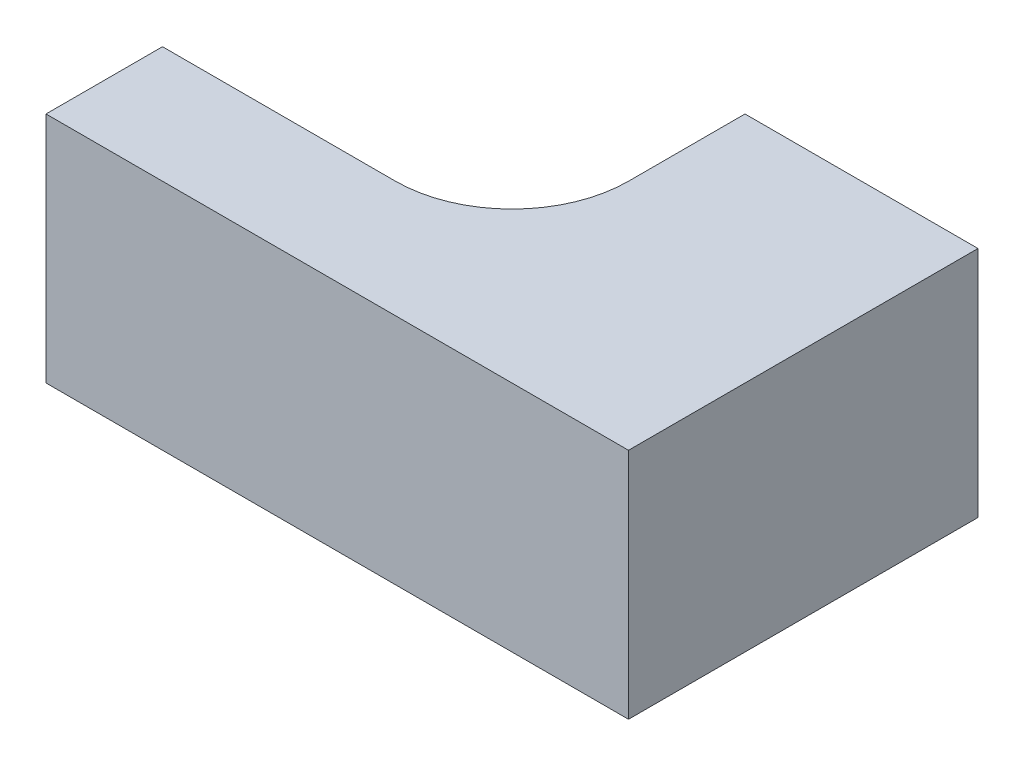
ISO-10303-21;
HEADER;
FILE_DESCRIPTION(('STEP AP214'),'2;1');
FILE_NAME('part.step','',(''),(''),'','','');
FILE_SCHEMA(('AUTOMOTIVE_DESIGN { 1 0 10303 214 1 1 1 1 }'));
ENDSEC;
DATA;
#1=APPLICATION_CONTEXT('core data for automotive mechanical design processes');
#2=APPLICATION_PROTOCOL_DEFINITION('international standard','automotive_design',2000,#1);
#3=PRODUCT_CONTEXT('',#1,'mechanical');
#4=PRODUCT('Part','Part','',(#3));
#5=PRODUCT_RELATED_PRODUCT_CATEGORY('part','',(#4));
#6=PRODUCT_DEFINITION_FORMATION('','',#4);
#7=PRODUCT_DEFINITION_CONTEXT('part definition',#1,'design');
#8=PRODUCT_DEFINITION('design','',#6,#7);
#9=PRODUCT_DEFINITION_SHAPE('','',#8);
#10=(LENGTH_UNIT() NAMED_UNIT(*) SI_UNIT(.MILLI.,.METRE.));
#11=(NAMED_UNIT(*) PLANE_ANGLE_UNIT() SI_UNIT($,.RADIAN.));
#12=(NAMED_UNIT(*) SI_UNIT($,.STERADIAN.) SOLID_ANGLE_UNIT());
#13=UNCERTAINTY_MEASURE_WITH_UNIT(LENGTH_MEASURE(1.E-05),#10,'distance_accuracy_value','');
#14=(GEOMETRIC_REPRESENTATION_CONTEXT(3) GLOBAL_UNCERTAINTY_ASSIGNED_CONTEXT((#13)) GLOBAL_UNIT_ASSIGNED_CONTEXT((#10,
#11,#12)) REPRESENTATION_CONTEXT('',''));
#15=CARTESIAN_POINT('',(0.,0.,0.));
#16=DIRECTION('',(0.,0.,1.));
#17=DIRECTION('',(1.,0.,0.));
#18=AXIS2_PLACEMENT_3D('',#15,#16,#17);
#19=CARTESIAN_POINT('',(-20.,20.,0.));
#20=DIRECTION('',(0.,0.,1.));
#21=DIRECTION('',(-1.,0.,0.));
#22=AXIS2_PLACEMENT_3D('',#19,#20,#21);
#23=PLANE('',#22);
#24=DIRECTION('',(1.,0.,0.));
#25=VECTOR('',#24,1.);
#26=CARTESIAN_POINT('',(-20.,0.,0.));
#27=LINE('',#26,#25);
#28=CARTESIAN_POINT('',(-40.,0.,0.));
#29=VERTEX_POINT('',#28);
#30=CARTESIAN_POINT('',(-20.,0.,0.));
#31=VERTEX_POINT('',#30);
#32=EDGE_CURVE('E134',#29,#31,#27,.T.);
#33=ORIENTED_EDGE('',*,*,#32,.F.);
#34=DIRECTION('',(0.,-1.,0.));
#35=VECTOR('',#34,1.);
#36=CARTESIAN_POINT('',(-40.,20.,0.));
#37=LINE('',#36,#35);
#38=CARTESIAN_POINT('',(-40.,20.,0.));
#39=VERTEX_POINT('',#38);
#40=EDGE_CURVE('E133',#39,#29,#37,.T.);
#41=ORIENTED_EDGE('',*,*,#40,.F.);
#42=DIRECTION('',(1.,0.,0.));
#43=VECTOR('',#42,1.);
#44=CARTESIAN_POINT('',(-20.,20.,0.));
#45=LINE('',#44,#43);
#46=CARTESIAN_POINT('',(-20.,20.,0.));
#47=VERTEX_POINT('',#46);
#48=EDGE_CURVE('E156',#39,#47,#45,.T.);
#49=ORIENTED_EDGE('',*,*,#48,.T.);
#50=DIRECTION('',(0.,-1.,0.));
#51=VECTOR('',#50,1.);
#52=CARTESIAN_POINT('',(-20.,20.,0.));
#53=LINE('',#52,#51);
#54=EDGE_CURVE('E11',#47,#31,#53,.T.);
#55=ORIENTED_EDGE('',*,*,#54,.T.);
#56=EDGE_LOOP('',(#33,#41,#49,#55));
#57=FACE_BOUND('',#56,.T.);
#58=ADVANCED_FACE('F38',(#57),#23,.F.);
#59=CARTESIAN_POINT('',(-20.,20.,30.));
#60=DIRECTION('',(-1.,0.,0.));
#61=DIRECTION('',(0.,0.,-1.));
#62=AXIS2_PLACEMENT_3D('',#59,#60,#61);
#63=PLANE('',#62);
#64=DIRECTION('',(0.,0.,1.));
#65=VECTOR('',#64,1.);
#66=CARTESIAN_POINT('',(-20.,0.,30.));
#67=LINE('',#66,#65);
#68=CARTESIAN_POINT('',(-20.,0.,30.));
#69=VERTEX_POINT('',#68);
#70=EDGE_CURVE('E137',#31,#69,#67,.T.);
#71=ORIENTED_EDGE('',*,*,#70,.F.);
#72=ORIENTED_EDGE('',*,*,#54,.F.);
#73=DIRECTION('',(0.,0.,1.));
#74=VECTOR('',#73,1.);
#75=CARTESIAN_POINT('',(-20.,20.,30.));
#76=LINE('',#75,#74);
#77=CARTESIAN_POINT('',(-20.,20.,30.));
#78=VERTEX_POINT('',#77);
#79=EDGE_CURVE('E90',#47,#78,#76,.T.);
#80=ORIENTED_EDGE('',*,*,#79,.T.);
#81=DIRECTION('',(0.,-1.,0.));
#82=VECTOR('',#81,1.);
#83=CARTESIAN_POINT('',(-20.,20.,30.));
#84=LINE('',#83,#82);
#85=EDGE_CURVE('E47',#78,#69,#84,.T.);
#86=ORIENTED_EDGE('',*,*,#85,.T.);
#87=EDGE_LOOP('',(#71,#72,#80,#86));
#88=FACE_BOUND('',#87,.T.);
#89=ADVANCED_FACE('F170',(#88),#63,.F.);
#90=CARTESIAN_POINT('',(-70.,20.,30.));
#91=DIRECTION('',(0.,0.,-1.));
#92=DIRECTION('',(1.,0.,0.));
#93=AXIS2_PLACEMENT_3D('',#90,#91,#92);
#94=PLANE('',#93);
#95=DIRECTION('',(-1.,0.,0.));
#96=VECTOR('',#95,1.);
#97=CARTESIAN_POINT('',(-70.,0.,30.));
#98=LINE('',#97,#96);
#99=CARTESIAN_POINT('',(-70.,0.,30.));
#100=VERTEX_POINT('',#99);
#101=EDGE_CURVE('E141',#69,#100,#98,.T.);
#102=ORIENTED_EDGE('',*,*,#101,.F.);
#103=ORIENTED_EDGE('',*,*,#85,.F.);
#104=DIRECTION('',(-1.,0.,0.));
#105=VECTOR('',#104,1.);
#106=CARTESIAN_POINT('',(-70.,20.,30.));
#107=LINE('',#106,#105);
#108=CARTESIAN_POINT('',(-70.,20.,30.));
#109=VERTEX_POINT('',#108);
#110=EDGE_CURVE('E127',#78,#109,#107,.T.);
#111=ORIENTED_EDGE('',*,*,#110,.T.);
#112=DIRECTION('',(0.,-1.,0.));
#113=VECTOR('',#112,1.);
#114=CARTESIAN_POINT('',(-70.,20.,30.));
#115=LINE('',#114,#113);
#116=EDGE_CURVE('E163',#109,#100,#115,.T.);
#117=ORIENTED_EDGE('',*,*,#116,.T.);
#118=EDGE_LOOP('',(#102,#103,#111,#117));
#119=FACE_BOUND('',#118,.T.);
#120=ADVANCED_FACE('F183',(#119),#94,.F.);
#121=CARTESIAN_POINT('',(-70.,20.,20.));
#122=DIRECTION('',(1.,0.,0.));
#123=DIRECTION('',(0.,0.,1.));
#124=AXIS2_PLACEMENT_3D('',#121,#122,#123);
#125=PLANE('',#124);
#126=DIRECTION('',(0.,0.,-1.));
#127=VECTOR('',#126,1.);
#128=CARTESIAN_POINT('',(-70.,0.,20.));
#129=LINE('',#128,#127);
#130=CARTESIAN_POINT('',(-70.,0.,20.));
#131=VERTEX_POINT('',#130);
#132=EDGE_CURVE('E145',#100,#131,#129,.T.);
#133=ORIENTED_EDGE('',*,*,#132,.F.);
#134=ORIENTED_EDGE('',*,*,#116,.F.);
#135=DIRECTION('',(0.,0.,-1.));
#136=VECTOR('',#135,1.);
#137=CARTESIAN_POINT('',(-70.,20.,20.));
#138=LINE('',#137,#136);
#139=CARTESIAN_POINT('',(-70.,20.,20.));
#140=VERTEX_POINT('',#139);
#141=EDGE_CURVE('E124',#109,#140,#138,.T.);
#142=ORIENTED_EDGE('',*,*,#141,.T.);
#143=DIRECTION('',(0.,-1.,0.));
#144=VECTOR('',#143,1.);
#145=CARTESIAN_POINT('',(-70.,20.,20.));
#146=LINE('',#145,#144);
#147=EDGE_CURVE('E117',#140,#131,#146,.T.);
#148=ORIENTED_EDGE('',*,*,#147,.T.);
#149=EDGE_LOOP('',(#133,#134,#142,#148));
#150=FACE_BOUND('',#149,.T.);
#151=ADVANCED_FACE('F186',(#150),#125,.F.);
#152=CARTESIAN_POINT('',(-50.,20.,20.));
#153=DIRECTION('',(0.,0.,1.));
#154=DIRECTION('',(-1.,0.,0.));
#155=AXIS2_PLACEMENT_3D('',#152,#153,#154);
#156=PLANE('',#155);
#157=DIRECTION('',(1.,0.,0.));
#158=VECTOR('',#157,1.);
#159=CARTESIAN_POINT('',(-50.,0.,20.));
#160=LINE('',#159,#158);
#161=CARTESIAN_POINT('',(-50.,0.,20.));
#162=VERTEX_POINT('',#161);
#163=EDGE_CURVE('E149',#131,#162,#160,.T.);
#164=ORIENTED_EDGE('',*,*,#163,.F.);
#165=ORIENTED_EDGE('',*,*,#147,.F.);
#166=DIRECTION('',(1.,0.,0.));
#167=VECTOR('',#166,1.);
#168=CARTESIAN_POINT('',(-50.,20.,20.));
#169=LINE('',#168,#167);
#170=CARTESIAN_POINT('',(-50.,20.,20.));
#171=VERTEX_POINT('',#170);
#172=EDGE_CURVE('E105',#140,#171,#169,.T.);
#173=ORIENTED_EDGE('',*,*,#172,.T.);
#174=DIRECTION('',(0.,-1.,0.));
#175=VECTOR('',#174,1.);
#176=CARTESIAN_POINT('',(-50.,20.,20.));
#177=LINE('',#176,#175);
#178=EDGE_CURVE('E111',#171,#162,#177,.T.);
#179=ORIENTED_EDGE('',*,*,#178,.T.);
#180=EDGE_LOOP('',(#164,#165,#173,#179));
#181=FACE_BOUND('',#180,.T.);
#182=ADVANCED_FACE('F120',(#181),#156,.F.);
#183=CARTESIAN_POINT('',(-50.,20.,10.));
#184=DIRECTION('',(0.,-1.,0.));
#185=DIRECTION('',(0.,0.,-1.));
#186=AXIS2_PLACEMENT_3D('',#183,#184,#185);
#187=CYLINDRICAL_SURFACE('',#186,10.);
#188=CARTESIAN_POINT('',(-50.,0.,10.));
#189=DIRECTION('',(0.,1.,0.));
#190=DIRECTION('',(0.,0.,1.));
#191=AXIS2_PLACEMENT_3D('',#188,#189,#190);
#192=CIRCLE('',#191,10.);
#193=CARTESIAN_POINT('',(-40.,0.,10.));
#194=VERTEX_POINT('',#193);
#195=EDGE_CURVE('E113',#162,#194,#192,.T.);
#196=ORIENTED_EDGE('',*,*,#195,.F.);
#197=ORIENTED_EDGE('',*,*,#178,.F.);
#198=CARTESIAN_POINT('',(-50.,20.,10.));
#199=DIRECTION('',(0.,1.,0.));
#200=DIRECTION('',(0.,0.,1.));
#201=AXIS2_PLACEMENT_3D('',#198,#199,#200);
#202=CIRCLE('',#201,10.);
#203=CARTESIAN_POINT('',(-40.,20.,10.));
#204=VERTEX_POINT('',#203);
#205=EDGE_CURVE('E101',#171,#204,#202,.T.);
#206=ORIENTED_EDGE('',*,*,#205,.T.);
#207=DIRECTION('',(0.,-1.,0.));
#208=VECTOR('',#207,1.);
#209=CARTESIAN_POINT('',(-40.,20.,10.));
#210=LINE('',#209,#208);
#211=EDGE_CURVE('E118',#204,#194,#210,.T.);
#212=ORIENTED_EDGE('',*,*,#211,.T.);
#213=EDGE_LOOP('',(#196,#197,#206,#212));
#214=FACE_BOUND('',#213,.T.);
#215=ADVANCED_FACE('F112',(#214),#187,.F.);
#216=CARTESIAN_POINT('',(-40.,20.,0.));
#217=DIRECTION('',(1.,0.,0.));
#218=DIRECTION('',(0.,0.,1.));
#219=AXIS2_PLACEMENT_3D('',#216,#217,#218);
#220=PLANE('',#219);
#221=DIRECTION('',(0.,0.,-1.));
#222=VECTOR('',#221,1.);
#223=CARTESIAN_POINT('',(-40.,0.,0.));
#224=LINE('',#223,#222);
#225=EDGE_CURVE('E78',#194,#29,#224,.T.);
#226=ORIENTED_EDGE('',*,*,#225,.F.);
#227=ORIENTED_EDGE('',*,*,#211,.F.);
#228=DIRECTION('',(0.,0.,-1.));
#229=VECTOR('',#228,1.);
#230=CARTESIAN_POINT('',(-40.,20.,0.));
#231=LINE('',#230,#229);
#232=EDGE_CURVE('E55',#204,#39,#231,.T.);
#233=ORIENTED_EDGE('',*,*,#232,.T.);
#234=ORIENTED_EDGE('',*,*,#40,.T.);
#235=EDGE_LOOP('',(#226,#227,#233,#234));
#236=FACE_BOUND('',#235,.T.);
#237=ADVANCED_FACE('F226',(#236),#220,.F.);
#238=CARTESIAN_POINT('',(-50.,20.,10.));
#239=DIRECTION('',(0.,1.,0.));
#240=DIRECTION('',(0.,0.,1.));
#241=AXIS2_PLACEMENT_3D('',#238,#239,#240);
#242=PLANE('',#241);
#243=ORIENTED_EDGE('',*,*,#48,.F.);
#244=ORIENTED_EDGE('',*,*,#232,.F.);
#245=ORIENTED_EDGE('',*,*,#205,.F.);
#246=ORIENTED_EDGE('',*,*,#172,.F.);
#247=ORIENTED_EDGE('',*,*,#141,.F.);
#248=ORIENTED_EDGE('',*,*,#110,.F.);
#249=ORIENTED_EDGE('',*,*,#79,.F.);
#250=EDGE_LOOP('',(#243,#244,#245,#246,#247,#248,#249));
#251=FACE_BOUND('',#250,.T.);
#252=ADVANCED_FACE('F103',(#251),#242,.T.);
#253=CARTESIAN_POINT('',(-50.,0.,10.));
#254=DIRECTION('',(0.,1.,0.));
#255=DIRECTION('',(0.,0.,1.));
#256=AXIS2_PLACEMENT_3D('',#253,#254,#255);
#257=PLANE('',#256);
#258=ORIENTED_EDGE('',*,*,#32,.T.);
#259=ORIENTED_EDGE('',*,*,#70,.T.);
#260=ORIENTED_EDGE('',*,*,#101,.T.);
#261=ORIENTED_EDGE('',*,*,#132,.T.);
#262=ORIENTED_EDGE('',*,*,#163,.T.);
#263=ORIENTED_EDGE('',*,*,#195,.T.);
#264=ORIENTED_EDGE('',*,*,#225,.T.);
#265=EDGE_LOOP('',(#258,#259,#260,#261,#262,#263,#264));
#266=FACE_BOUND('',#265,.T.);
#267=ADVANCED_FACE('F173',(#266),#257,.F.);
#268=CLOSED_SHELL('',(#58,#89,#120,#151,#182,#215,#237,#252,#267));
#269=MANIFOLD_SOLID_BREP('B2',#268);
#270=ADVANCED_BREP_SHAPE_REPRESENTATION('',(#18,#269),#14);
#271=SHAPE_DEFINITION_REPRESENTATION(#9,#270);
ENDSEC;
END-ISO-10303-21;
